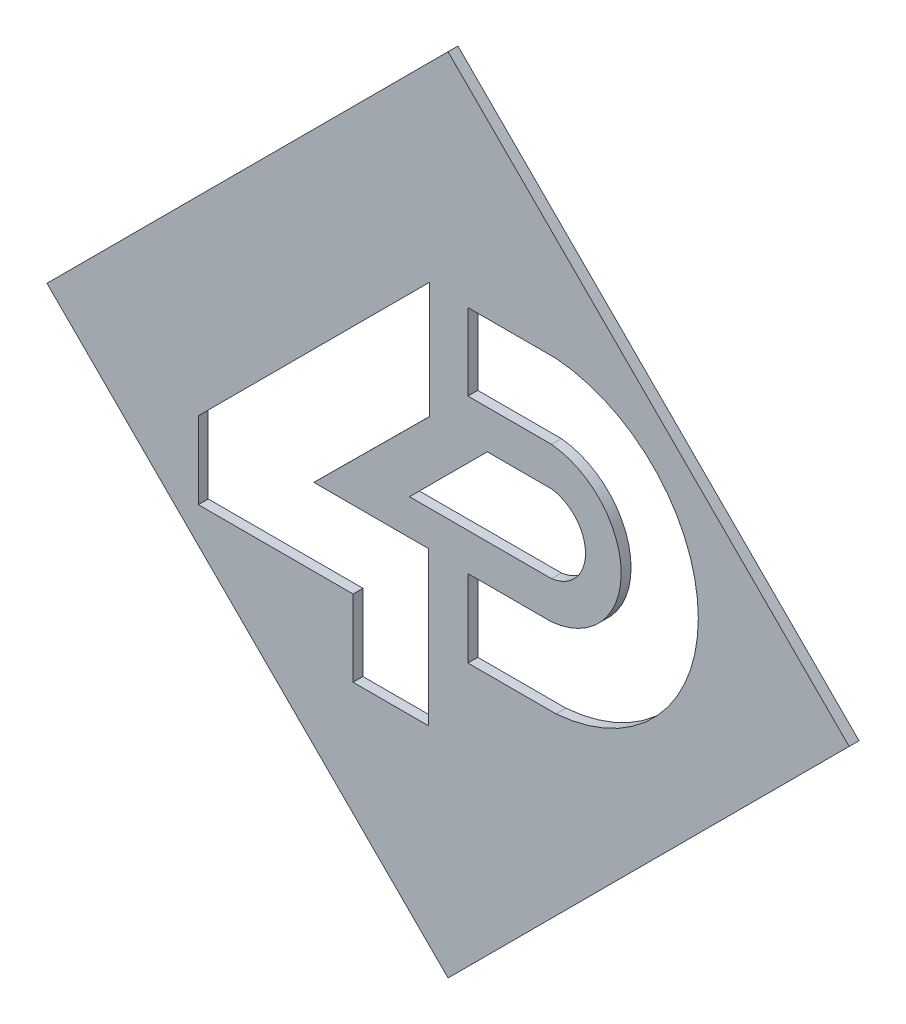
ISO-10303-21;
HEADER;
FILE_DESCRIPTION(('STEP AP214'),'2;1');
FILE_NAME('part.step','',(''),(''),'','','');
FILE_SCHEMA(('AUTOMOTIVE_DESIGN { 1 0 10303 214 1 1 1 1 }'));
ENDSEC;
DATA;
#1=APPLICATION_CONTEXT('core data for automotive mechanical design processes');
#2=APPLICATION_PROTOCOL_DEFINITION('international standard','automotive_design',2000,#1);
#3=PRODUCT_CONTEXT('',#1,'mechanical');
#4=PRODUCT('Part','Part','',(#3));
#5=PRODUCT_RELATED_PRODUCT_CATEGORY('part','',(#4));
#6=PRODUCT_DEFINITION_FORMATION('','',#4);
#7=PRODUCT_DEFINITION_CONTEXT('part definition',#1,'design');
#8=PRODUCT_DEFINITION('design','',#6,#7);
#9=PRODUCT_DEFINITION_SHAPE('','',#8);
#10=(LENGTH_UNIT() NAMED_UNIT(*) SI_UNIT(.MILLI.,.METRE.));
#11=(NAMED_UNIT(*) PLANE_ANGLE_UNIT() SI_UNIT($,.RADIAN.));
#12=(NAMED_UNIT(*) SI_UNIT($,.STERADIAN.) SOLID_ANGLE_UNIT());
#13=UNCERTAINTY_MEASURE_WITH_UNIT(LENGTH_MEASURE(1.E-05),#10,'distance_accuracy_value','');
#14=(GEOMETRIC_REPRESENTATION_CONTEXT(3) GLOBAL_UNCERTAINTY_ASSIGNED_CONTEXT((#13)) GLOBAL_UNIT_ASSIGNED_CONTEXT((#10,
#11,#12)) REPRESENTATION_CONTEXT('',''));
#15=CARTESIAN_POINT('',(0.,0.,0.));
#16=DIRECTION('',(0.,0.,1.));
#17=DIRECTION('',(1.,0.,0.));
#18=AXIS2_PLACEMENT_3D('',#15,#16,#17);
#19=CARTESIAN_POINT('',(0.,0.,0.));
#20=DIRECTION('',(0.,0.,1.));
#21=DIRECTION('',(1.,0.,0.));
#22=AXIS2_PLACEMENT_3D('',#19,#20,#21);
#23=PLANE('',#22);
#24=DIRECTION('',(0.,1.,0.));
#25=VECTOR('',#24,1.);
#26=CARTESIAN_POINT('',(2.34855929874096,0.,0.));
#27=LINE('',#26,#25);
#28=CARTESIAN_POINT('',(2.34855929874096,2.81911332569856,0.));
#29=VERTEX_POINT('',#28);
#30=CARTESIAN_POINT('',(2.34855929874096,3.20697935121629,0.));
#31=VERTEX_POINT('',#30);
#32=EDGE_CURVE('E129',#29,#31,#27,.T.);
#33=ORIENTED_EDGE('',*,*,#32,.F.);
#34=DIRECTION('',(1.,0.,0.));
#35=VECTOR('',#34,1.);
#36=CARTESIAN_POINT('',(0.,2.81911332569856,0.));
#37=LINE('',#36,#35);
#38=CARTESIAN_POINT('',(2.77126569834154,2.81911332569856,0.));
#39=VERTEX_POINT('',#38);
#40=EDGE_CURVE('E120',#39,#29,#37,.F.);
#41=ORIENTED_EDGE('',*,*,#40,.F.);
#42=CARTESIAN_POINT('',(2.73306572387602,2.43000474208377,0.));
#43=DIRECTION('',(0.,0.,-1.));
#44=DIRECTION('',(-1.,0.,0.));
#45=AXIS2_PLACEMENT_3D('',#42,#43,#44);
#46=CIRCLE('',#45,0.390979191123868);
#47=CARTESIAN_POINT('',(2.77126569834155,2.04089615846898,0.));
#48=VERTEX_POINT('',#47);
#49=EDGE_CURVE('E19',#48,#39,#46,.F.);
#50=ORIENTED_EDGE('',*,*,#49,.F.);
#51=DIRECTION('',(1.,0.,0.));
#52=VECTOR('',#51,1.);
#53=CARTESIAN_POINT('',(0.,2.04089615846898,0.));
#54=LINE('',#53,#52);
#55=CARTESIAN_POINT('',(2.34855929874096,2.04089615846898,0.));
#56=VERTEX_POINT('',#55);
#57=EDGE_CURVE('E108',#56,#48,#54,.T.);
#58=ORIENTED_EDGE('',*,*,#57,.F.);
#59=DIRECTION('',(0.,1.,0.));
#60=VECTOR('',#59,1.);
#61=CARTESIAN_POINT('',(2.34855929874096,0.,0.));
#62=LINE('',#61,#60);
#63=CARTESIAN_POINT('',(2.34855929874096,1.64907524947541,0.));
#64=VERTEX_POINT('',#63);
#65=EDGE_CURVE('E140',#64,#56,#62,.T.);
#66=ORIENTED_EDGE('',*,*,#65,.F.);
#67=DIRECTION('',(1.,0.,0.));
#68=VECTOR('',#67,1.);
#69=CARTESIAN_POINT('',(0.,1.64907524947541,0.));
#70=LINE('',#69,#68);
#71=CARTESIAN_POINT('',(2.79424037581923,1.64907524947541,0.));
#72=VERTEX_POINT('',#71);
#73=EDGE_CURVE('E143',#72,#64,#70,.F.);
#74=ORIENTED_EDGE('',*,*,#73,.F.);
#75=CARTESIAN_POINT('',(2.73302059377574,2.42802730034585,0.));
#76=DIRECTION('',(0.,0.,-1.));
#77=DIRECTION('',(-1.,0.,0.));
#78=AXIS2_PLACEMENT_3D('',#75,#76,#77);
#79=CIRCLE('',#78,0.781354055002415);
#80=CARTESIAN_POINT('',(2.79424037581924,3.20697935121629,0.));
#81=VERTEX_POINT('',#80);
#82=EDGE_CURVE('E182',#72,#81,#79,.F.);
#83=ORIENTED_EDGE('',*,*,#82,.T.);
#84=DIRECTION('',(1.,0.,0.));
#85=VECTOR('',#84,1.);
#86=CARTESIAN_POINT('',(0.,3.20697935121629,0.));
#87=LINE('',#86,#85);
#88=EDGE_CURVE('E201',#31,#81,#87,.T.);
#89=ORIENTED_EDGE('',*,*,#88,.F.);
#90=EDGE_LOOP('',(#33,#41,#50,#58,#66,#74,#83,#89));
#91=FACE_BOUND('',#90,.T.);
#92=DIRECTION('',(-0.707106781186548,-0.707106781186548,0.));
#93=VECTOR('',#92,1.);
#94=CARTESIAN_POINT('',(-0.533274055166279,0.533274055166279,0.));
#95=LINE('',#94,#93);
#96=CARTESIAN_POINT('',(2.15427685135592,3.22082496168848,0.));
#97=VERTEX_POINT('',#96);
#98=CARTESIAN_POINT('',(0.984186914350329,2.05073502468289,0.));
#99=VERTEX_POINT('',#98);
#100=EDGE_CURVE('E202',#97,#99,#95,.T.);
#101=ORIENTED_EDGE('',*,*,#100,.T.);
#102=DIRECTION('',(0.,1.,0.));
#103=VECTOR('',#102,1.);
#104=CARTESIAN_POINT('',(0.984186914350328,0.,0.));
#105=LINE('',#104,#103);
#106=CARTESIAN_POINT('',(0.984186914350328,1.66089182529602,0.));
#107=VERTEX_POINT('',#106);
#108=EDGE_CURVE('E223',#99,#107,#105,.F.);
#109=ORIENTED_EDGE('',*,*,#108,.T.);
#110=DIRECTION('',(1.,0.,0.));
#111=VECTOR('',#110,1.);
#112=CARTESIAN_POINT('',(0.,1.66089182529602,0.));
#113=LINE('',#112,#111);
#114=CARTESIAN_POINT('',(1.76699830871032,1.66089182529602,0.));
#115=VERTEX_POINT('',#114);
#116=EDGE_CURVE('E228',#107,#115,#113,.T.);
#117=ORIENTED_EDGE('',*,*,#116,.T.);
#118=DIRECTION('',(0.,1.,0.));
#119=VECTOR('',#118,1.);
#120=CARTESIAN_POINT('',(1.76699830871032,0.,0.));
#121=LINE('',#120,#119);
#122=CARTESIAN_POINT('',(1.76699830871032,1.27417362149543,0.));
#123=VERTEX_POINT('',#122);
#124=EDGE_CURVE('E237',#123,#115,#121,.T.);
#125=ORIENTED_EDGE('',*,*,#124,.F.);
#126=DIRECTION('',(1.,0.,0.));
#127=VECTOR('',#126,1.);
#128=CARTESIAN_POINT('',(0.,1.27417362149543,0.));
#129=LINE('',#128,#127);
#130=CARTESIAN_POINT('',(2.14981026802808,1.27417362149543,0.));
#131=VERTEX_POINT('',#130);
#132=EDGE_CURVE('E243',#131,#123,#129,.F.);
#133=ORIENTED_EDGE('',*,*,#132,.F.);
#134=DIRECTION('',(0.,1.,0.));
#135=VECTOR('',#134,1.);
#136=CARTESIAN_POINT('',(2.14981026802808,0.,0.));
#137=LINE('',#136,#135);
#138=CARTESIAN_POINT('',(2.14981026802808,2.05073502468289,0.));
#139=VERTEX_POINT('',#138);
#140=EDGE_CURVE('E249',#139,#131,#137,.F.);
#141=ORIENTED_EDGE('',*,*,#140,.F.);
#142=DIRECTION('',(1.,0.,0.));
#143=VECTOR('',#142,1.);
#144=CARTESIAN_POINT('',(0.,2.05073502468289,0.));
#145=LINE('',#144,#143);
#146=CARTESIAN_POINT('',(1.56856108898234,2.05073502468289,0.));
#147=VERTEX_POINT('',#146);
#148=EDGE_CURVE('E255',#147,#139,#145,.T.);
#149=ORIENTED_EDGE('',*,*,#148,.F.);
#150=DIRECTION('',(0.709780855705061,0.704422555625948,0.));
#151=VECTOR('',#150,1.);
#152=CARTESIAN_POINT('',(-0.247000591404252,0.248879439941812,0.));
#153=LINE('',#152,#151);
#154=CARTESIAN_POINT('',(2.15427685135592,2.63202908310287,0.));
#155=VERTEX_POINT('',#154);
#156=EDGE_CURVE('E258',#147,#155,#153,.T.);
#157=ORIENTED_EDGE('',*,*,#156,.T.);
#158=DIRECTION('',(0.,1.,0.));
#159=VECTOR('',#158,1.);
#160=CARTESIAN_POINT('',(2.15427685135592,0.,0.));
#161=LINE('',#160,#159);
#162=EDGE_CURVE('E264',#155,#97,#161,.T.);
#163=ORIENTED_EDGE('',*,*,#162,.T.);
#164=EDGE_LOOP('',(#101,#109,#117,#125,#133,#141,#149,#157,#163));
#165=FACE_BOUND('',#164,.T.);
#166=DIRECTION('',(0.707106781186547,0.707106781186548,0.));
#167=VECTOR('',#166,1.);
#168=CARTESIAN_POINT('',(-1.01513037245142,1.01513037245142,0.));
#169=LINE('',#168,#167);
#170=CARTESIAN_POINT('',(0.217904955586662,2.2481657004895,0.));
#171=VERTEX_POINT('',#170);
#172=CARTESIAN_POINT('',(2.24790091175695,4.27816165665979,0.));
#173=VERTEX_POINT('',#172);
#174=EDGE_CURVE('E266',#171,#173,#169,.T.);
#175=ORIENTED_EDGE('',*,*,#174,.T.);
#176=DIRECTION('',(0.707106781186548,-0.707106781186547,0.));
#177=VECTOR('',#176,1.);
#178=CARTESIAN_POINT('',(3.26303128420836,3.26303128420837,0.));
#179=LINE('',#178,#177);
#180=CARTESIAN_POINT('',(4.27789686792724,2.2481657004895,0.));
#181=VERTEX_POINT('',#180);
#182=EDGE_CURVE('E275',#173,#181,#179,.T.);
#183=ORIENTED_EDGE('',*,*,#182,.T.);
#184=DIRECTION('',(-0.707106781186547,-0.707106781186548,0.));
#185=VECTOR('',#184,1.);
#186=CARTESIAN_POINT('',(1.01486558371887,-1.01486558371887,0.));
#187=LINE('',#186,#185);
#188=CARTESIAN_POINT('',(2.24790091175711,0.218169744319375,0.));
#189=VERTEX_POINT('',#188);
#190=EDGE_CURVE('E281',#181,#189,#187,.T.);
#191=ORIENTED_EDGE('',*,*,#190,.T.);
#192=DIRECTION('',(0.707106781186662,-0.707106781186433,0.));
#193=VECTOR('',#192,1.);
#194=CARTESIAN_POINT('',(1.23303532803804,1.23303532803844,0.));
#195=LINE('',#194,#193);
#196=EDGE_CURVE('E156',#171,#189,#195,.T.);
#197=ORIENTED_EDGE('',*,*,#196,.F.);
#198=EDGE_LOOP('',(#175,#183,#191,#197));
#199=FACE_BOUND('',#198,.T.);
#200=DIRECTION('',(-0.707106781186546,-0.707106781186549,0.));
#201=VECTOR('',#200,1.);
#202=CARTESIAN_POINT('',(-0.088632997302492,0.0886329973024917,0.));
#203=LINE('',#202,#201);
#204=CARTESIAN_POINT('',(2.44646139549115,2.62372739009615,0.));
#205=VERTEX_POINT('',#204);
#206=CARTESIAN_POINT('',(2.05288992525324,2.23015591985823,0.));
#207=VERTEX_POINT('',#206);
#208=EDGE_CURVE('E153',#205,#207,#203,.T.);
#209=ORIENTED_EDGE('',*,*,#208,.T.);
#210=DIRECTION('',(1.,0.,0.));
#211=VECTOR('',#210,1.);
#212=CARTESIAN_POINT('',(0.,2.23015591985823,0.));
#213=LINE('',#212,#211);
#214=CARTESIAN_POINT('',(2.77126569834154,2.23015591985823,0.));
#215=VERTEX_POINT('',#214);
#216=EDGE_CURVE('E160',#215,#207,#213,.F.);
#217=ORIENTED_EDGE('',*,*,#216,.F.);
#218=CARTESIAN_POINT('',(2.74507089152506,2.42694165497719,0.));
#219=DIRECTION('',(0.,0.,-1.));
#220=DIRECTION('',(-1.,0.,0.));
#221=AXIS2_PLACEMENT_3D('',#218,#219,#220);
#222=CIRCLE('',#221,0.198521518859953);
#223=CARTESIAN_POINT('',(2.77126569834155,2.62372739009615,0.));
#224=VERTEX_POINT('',#223);
#225=EDGE_CURVE('E163',#215,#224,#222,.F.);
#226=ORIENTED_EDGE('',*,*,#225,.T.);
#227=DIRECTION('',(1.,0.,0.));
#228=VECTOR('',#227,1.);
#229=CARTESIAN_POINT('',(0.,2.62372739009615,0.));
#230=LINE('',#229,#228);
#231=EDGE_CURVE('E131',#224,#205,#230,.F.);
#232=ORIENTED_EDGE('',*,*,#231,.T.);
#233=EDGE_LOOP('',(#209,#217,#226,#232));
#234=FACE_BOUND('',#233,.T.);
#235=ADVANCED_FACE('F16',(#91,#165,#199,#234),#23,.F.);
#236=CARTESIAN_POINT('',(0.,2.62372739009615,0.05));
#237=DIRECTION('',(0.,1.,0.));
#238=DIRECTION('',(0.,0.,1.));
#239=AXIS2_PLACEMENT_3D('',#236,#237,#238);
#240=PLANE('',#239);
#241=DIRECTION('',(0.,0.,-1.));
#242=VECTOR('',#241,1.);
#243=CARTESIAN_POINT('',(2.77126569834155,2.62372739009615,0.05));
#244=LINE('',#243,#242);
#245=CARTESIAN_POINT('',(2.77126569834155,2.62372739009615,0.05));
#246=VERTEX_POINT('',#245);
#247=EDGE_CURVE('E150',#224,#246,#244,.F.);
#248=ORIENTED_EDGE('',*,*,#247,.T.);
#249=DIRECTION('',(1.,0.,0.));
#250=VECTOR('',#249,1.);
#251=CARTESIAN_POINT('',(0.,2.62372739009615,0.05));
#252=LINE('',#251,#250);
#253=CARTESIAN_POINT('',(2.44646139549116,2.62372739009615,0.05));
#254=VERTEX_POINT('',#253);
#255=EDGE_CURVE('E181',#254,#246,#252,.T.);
#256=ORIENTED_EDGE('',*,*,#255,.F.);
#257=DIRECTION('',(0.,0.,1.));
#258=VECTOR('',#257,1.);
#259=CARTESIAN_POINT('',(2.44646139549115,2.62372739009615,0.05));
#260=LINE('',#259,#258);
#261=EDGE_CURVE('E157',#254,#205,#260,.F.);
#262=ORIENTED_EDGE('',*,*,#261,.T.);
#263=ORIENTED_EDGE('',*,*,#231,.F.);
#264=EDGE_LOOP('',(#248,#256,#262,#263));
#265=FACE_BOUND('',#264,.T.);
#266=ADVANCED_FACE('F484',(#265),#240,.F.);
#267=CARTESIAN_POINT('',(2.74507089152506,2.42694165497719,0.05));
#268=DIRECTION('',(0.,0.,-1.));
#269=DIRECTION('',(-1.,0.,0.));
#270=AXIS2_PLACEMENT_3D('',#267,#268,#269);
#271=CYLINDRICAL_SURFACE('',#270,0.198521518859953);
#272=DIRECTION('',(0.,0.,1.));
#273=VECTOR('',#272,1.);
#274=CARTESIAN_POINT('',(2.77126569834155,2.23015591985823,0.05));
#275=LINE('',#274,#273);
#276=CARTESIAN_POINT('',(2.77126569834154,2.23015591985823,0.05));
#277=VERTEX_POINT('',#276);
#278=EDGE_CURVE('E162',#277,#215,#275,.F.);
#279=ORIENTED_EDGE('',*,*,#278,.F.);
#280=CARTESIAN_POINT('',(2.74507089152506,2.42694165497719,0.05));
#281=DIRECTION('',(0.,0.,-1.));
#282=DIRECTION('',(-1.,0.,0.));
#283=AXIS2_PLACEMENT_3D('',#280,#281,#282);
#284=CIRCLE('',#283,0.198521518859953);
#285=EDGE_CURVE('E177',#246,#277,#284,.T.);
#286=ORIENTED_EDGE('',*,*,#285,.F.);
#287=ORIENTED_EDGE('',*,*,#247,.F.);
#288=ORIENTED_EDGE('',*,*,#225,.F.);
#289=EDGE_LOOP('',(#279,#286,#287,#288));
#290=FACE_BOUND('',#289,.T.);
#291=ADVANCED_FACE('F489',(#290),#271,.F.);
#292=CARTESIAN_POINT('',(0.,2.23015591985823,0.05));
#293=DIRECTION('',(0.,1.,0.));
#294=DIRECTION('',(0.,0.,1.));
#295=AXIS2_PLACEMENT_3D('',#292,#293,#294);
#296=PLANE('',#295);
#297=DIRECTION('',(1.,0.,0.));
#298=VECTOR('',#297,1.);
#299=CARTESIAN_POINT('',(0.,2.23015591985823,0.05));
#300=LINE('',#299,#298);
#301=CARTESIAN_POINT('',(2.05288992525324,2.23015591985823,0.05));
#302=VERTEX_POINT('',#301);
#303=EDGE_CURVE('E180',#277,#302,#300,.F.);
#304=ORIENTED_EDGE('',*,*,#303,.F.);
#305=ORIENTED_EDGE('',*,*,#278,.T.);
#306=ORIENTED_EDGE('',*,*,#216,.T.);
#307=DIRECTION('',(0.,0.,1.));
#308=VECTOR('',#307,1.);
#309=CARTESIAN_POINT('',(2.05288992525324,2.23015591985823,0.05));
#310=LINE('',#309,#308);
#311=EDGE_CURVE('E199',#207,#302,#310,.T.);
#312=ORIENTED_EDGE('',*,*,#311,.T.);
#313=EDGE_LOOP('',(#304,#305,#306,#312));
#314=FACE_BOUND('',#313,.T.);
#315=ADVANCED_FACE('F300',(#314),#296,.T.);
#316=CARTESIAN_POINT('',(-0.088632997302492,0.0886329973024917,0.05));
#317=DIRECTION('',(-0.707106781186549,0.707106781186546,0.));
#318=DIRECTION('',(-0.707106781186546,-0.707106781186549,0.));
#319=AXIS2_PLACEMENT_3D('',#316,#317,#318);
#320=PLANE('',#319);
#321=ORIENTED_EDGE('',*,*,#261,.F.);
#322=DIRECTION('',(0.707106781186546,0.707106781186549,0.));
#323=VECTOR('',#322,1.);
#324=CARTESIAN_POINT('',(2.05288992525324,2.23015591985823,0.05));
#325=LINE('',#324,#323);
#326=EDGE_CURVE('E291',#302,#254,#325,.T.);
#327=ORIENTED_EDGE('',*,*,#326,.F.);
#328=ORIENTED_EDGE('',*,*,#311,.F.);
#329=ORIENTED_EDGE('',*,*,#208,.F.);
#330=EDGE_LOOP('',(#321,#327,#328,#329));
#331=FACE_BOUND('',#330,.T.);
#332=ADVANCED_FACE('F305',(#331),#320,.F.);
#333=CARTESIAN_POINT('',(1.23303532803804,1.23303532803844,0.05));
#334=DIRECTION('',(-0.707106781186433,-0.707106781186662,0.));
#335=DIRECTION('',(0.707106781186662,-0.707106781186433,0.));
#336=AXIS2_PLACEMENT_3D('',#333,#334,#335);
#337=PLANE('',#336);
#338=DIRECTION('',(0.707106781186548,-0.707106781186547,0.));
#339=VECTOR('',#338,1.);
#340=CARTESIAN_POINT('',(0.217904955586661,2.2481657004895,0.05));
#341=LINE('',#340,#339);
#342=CARTESIAN_POINT('',(0.217904955586661,2.2481657004895,0.05));
#343=VERTEX_POINT('',#342);
#344=CARTESIAN_POINT('',(2.24790091175711,0.218169744319375,0.05));
#345=VERTEX_POINT('',#344);
#346=EDGE_CURVE('E294',#343,#345,#341,.T.);
#347=ORIENTED_EDGE('',*,*,#346,.F.);
#348=DIRECTION('',(0.,0.,1.));
#349=VECTOR('',#348,1.);
#350=CARTESIAN_POINT('',(0.217904955586662,2.2481657004895,0.05));
#351=LINE('',#350,#349);
#352=EDGE_CURVE('E269',#343,#171,#351,.F.);
#353=ORIENTED_EDGE('',*,*,#352,.T.);
#354=ORIENTED_EDGE('',*,*,#196,.T.);
#355=DIRECTION('',(0.,0.,1.));
#356=VECTOR('',#355,1.);
#357=CARTESIAN_POINT('',(2.24790091175695,0.218169744319212,0.05));
#358=LINE('',#357,#356);
#359=EDGE_CURVE('E284',#189,#345,#358,.T.);
#360=ORIENTED_EDGE('',*,*,#359,.T.);
#361=EDGE_LOOP('',(#347,#353,#354,#360));
#362=FACE_BOUND('',#361,.T.);
#363=ADVANCED_FACE('F404',(#362),#337,.T.);
#364=CARTESIAN_POINT('',(1.01486558371887,-1.01486558371887,0.05));
#365=DIRECTION('',(-0.707106781186548,0.707106781186547,0.));
#366=DIRECTION('',(-0.707106781186547,-0.707106781186548,0.));
#367=AXIS2_PLACEMENT_3D('',#364,#365,#366);
#368=PLANE('',#367);
#369=DIRECTION('',(0.,0.,1.));
#370=VECTOR('',#369,1.);
#371=CARTESIAN_POINT('',(4.27789686792724,2.2481657004895,0.05));
#372=LINE('',#371,#370);
#373=CARTESIAN_POINT('',(4.27789686792724,2.2481657004895,0.05));
#374=VERTEX_POINT('',#373);
#375=EDGE_CURVE('E278',#181,#374,#372,.T.);
#376=ORIENTED_EDGE('',*,*,#375,.T.);
#377=DIRECTION('',(0.707106781186547,0.707106781186548,0.));
#378=VECTOR('',#377,1.);
#379=CARTESIAN_POINT('',(2.24790091175695,0.218169744319211,0.05));
#380=LINE('',#379,#378);
#381=EDGE_CURVE('E392',#345,#374,#380,.T.);
#382=ORIENTED_EDGE('',*,*,#381,.F.);
#383=ORIENTED_EDGE('',*,*,#359,.F.);
#384=ORIENTED_EDGE('',*,*,#190,.F.);
#385=EDGE_LOOP('',(#376,#382,#383,#384));
#386=FACE_BOUND('',#385,.T.);
#387=ADVANCED_FACE('F555',(#386),#368,.F.);
#388=CARTESIAN_POINT('',(3.26303128420836,3.26303128420837,0.05));
#389=DIRECTION('',(-0.707106781186547,-0.707106781186548,0.));
#390=DIRECTION('',(0.707106781186548,-0.707106781186547,0.));
#391=AXIS2_PLACEMENT_3D('',#388,#389,#390);
#392=PLANE('',#391);
#393=DIRECTION('',(0.,0.,1.));
#394=VECTOR('',#393,1.);
#395=CARTESIAN_POINT('',(2.24790091175695,4.27816165665979,0.05));
#396=LINE('',#395,#394);
#397=CARTESIAN_POINT('',(2.24790091175695,4.27816165665979,0.05));
#398=VERTEX_POINT('',#397);
#399=EDGE_CURVE('E272',#173,#398,#396,.T.);
#400=ORIENTED_EDGE('',*,*,#399,.T.);
#401=DIRECTION('',(-0.707106781186548,0.707106781186547,0.));
#402=VECTOR('',#401,1.);
#403=CARTESIAN_POINT('',(4.27789686792724,2.2481657004895,0.05));
#404=LINE('',#403,#402);
#405=EDGE_CURVE('E390',#374,#398,#404,.T.);
#406=ORIENTED_EDGE('',*,*,#405,.F.);
#407=ORIENTED_EDGE('',*,*,#375,.F.);
#408=ORIENTED_EDGE('',*,*,#182,.F.);
#409=EDGE_LOOP('',(#400,#406,#407,#408));
#410=FACE_BOUND('',#409,.T.);
#411=ADVANCED_FACE('F552',(#410),#392,.F.);
#412=CARTESIAN_POINT('',(-1.01513037245142,1.01513037245142,0.05));
#413=DIRECTION('',(0.707106781186548,-0.707106781186547,0.));
#414=DIRECTION('',(0.707106781186547,0.707106781186548,0.));
#415=AXIS2_PLACEMENT_3D('',#412,#413,#414);
#416=PLANE('',#415);
#417=ORIENTED_EDGE('',*,*,#352,.F.);
#418=DIRECTION('',(-0.707106781186547,-0.707106781186548,0.));
#419=VECTOR('',#418,1.);
#420=CARTESIAN_POINT('',(2.24790091175695,4.27816165665979,0.05));
#421=LINE('',#420,#419);
#422=EDGE_CURVE('E387',#398,#343,#421,.T.);
#423=ORIENTED_EDGE('',*,*,#422,.F.);
#424=ORIENTED_EDGE('',*,*,#399,.F.);
#425=ORIENTED_EDGE('',*,*,#174,.F.);
#426=EDGE_LOOP('',(#417,#423,#424,#425));
#427=FACE_BOUND('',#426,.T.);
#428=ADVANCED_FACE('F410',(#427),#416,.F.);
#429=CARTESIAN_POINT('',(2.15427685135592,0.,0.05));
#430=DIRECTION('',(1.,0.,0.));
#431=DIRECTION('',(0.,0.,-1.));
#432=AXIS2_PLACEMENT_3D('',#429,#430,#431);
#433=PLANE('',#432);
#434=DIRECTION('',(0.,0.,1.));
#435=VECTOR('',#434,1.);
#436=CARTESIAN_POINT('',(2.15427685135592,2.63202908310287,0.05));
#437=LINE('',#436,#435);
#438=CARTESIAN_POINT('',(2.15427685135592,2.63202908310287,0.05));
#439=VERTEX_POINT('',#438);
#440=EDGE_CURVE('E261',#155,#439,#437,.T.);
#441=ORIENTED_EDGE('',*,*,#440,.T.);
#442=DIRECTION('',(0.,1.,0.));
#443=VECTOR('',#442,1.);
#444=CARTESIAN_POINT('',(2.15427685135592,0.,0.05));
#445=LINE('',#444,#443);
#446=CARTESIAN_POINT('',(2.15427685135592,3.22082496168848,0.05));
#447=VERTEX_POINT('',#446);
#448=EDGE_CURVE('E384',#447,#439,#445,.F.);
#449=ORIENTED_EDGE('',*,*,#448,.F.);
#450=DIRECTION('',(0.,0.,1.));
#451=VECTOR('',#450,1.);
#452=CARTESIAN_POINT('',(2.15427685135592,3.22082496168848,0.05));
#453=LINE('',#452,#451);
#454=EDGE_CURVE('E207',#447,#97,#453,.F.);
#455=ORIENTED_EDGE('',*,*,#454,.T.);
#456=ORIENTED_EDGE('',*,*,#162,.F.);
#457=EDGE_LOOP('',(#441,#449,#455,#456));
#458=FACE_BOUND('',#457,.T.);
#459=ADVANCED_FACE('F545',(#458),#433,.F.);
#460=CARTESIAN_POINT('',(-0.247000591404252,0.248879439941812,0.05));
#461=DIRECTION('',(0.704422555625948,-0.709780855705061,0.));
#462=DIRECTION('',(0.709780855705061,0.704422555625948,0.));
#463=AXIS2_PLACEMENT_3D('',#460,#461,#462);
#464=PLANE('',#463);
#465=DIRECTION('',(0.,0.,-1.));
#466=VECTOR('',#465,1.);
#467=CARTESIAN_POINT('',(1.56856108898234,2.05073502468289,0.05));
#468=LINE('',#467,#466);
#469=CARTESIAN_POINT('',(1.56856108898234,2.05073502468289,0.05));
#470=VERTEX_POINT('',#469);
#471=EDGE_CURVE('E252',#470,#147,#468,.T.);
#472=ORIENTED_EDGE('',*,*,#471,.F.);
#473=DIRECTION('',(-0.70978085570506,-0.704422555625948,0.));
#474=VECTOR('',#473,1.);
#475=CARTESIAN_POINT('',(2.15427685135592,2.63202908310287,0.05));
#476=LINE('',#475,#474);
#477=EDGE_CURVE('E381',#439,#470,#476,.T.);
#478=ORIENTED_EDGE('',*,*,#477,.F.);
#479=ORIENTED_EDGE('',*,*,#440,.F.);
#480=ORIENTED_EDGE('',*,*,#156,.F.);
#481=EDGE_LOOP('',(#472,#478,#479,#480));
#482=FACE_BOUND('',#481,.T.);
#483=ADVANCED_FACE('F541',(#482),#464,.F.);
#484=CARTESIAN_POINT('',(0.,2.05073502468289,0.05));
#485=DIRECTION('',(0.,-1.,0.));
#486=DIRECTION('',(0.,0.,-1.));
#487=AXIS2_PLACEMENT_3D('',#484,#485,#486);
#488=PLANE('',#487);
#489=DIRECTION('',(1.,0.,0.));
#490=VECTOR('',#489,1.);
#491=CARTESIAN_POINT('',(0.,2.05073502468289,0.05));
#492=LINE('',#491,#490);
#493=CARTESIAN_POINT('',(2.14981026802808,2.05073502468289,0.05));
#494=VERTEX_POINT('',#493);
#495=EDGE_CURVE('E378',#470,#494,#492,.T.);
#496=ORIENTED_EDGE('',*,*,#495,.F.);
#497=ORIENTED_EDGE('',*,*,#471,.T.);
#498=ORIENTED_EDGE('',*,*,#148,.T.);
#499=DIRECTION('',(0.,0.,1.));
#500=VECTOR('',#499,1.);
#501=CARTESIAN_POINT('',(2.14981026802808,2.05073502468289,0.05));
#502=LINE('',#501,#500);
#503=EDGE_CURVE('E246',#494,#139,#502,.F.);
#504=ORIENTED_EDGE('',*,*,#503,.F.);
#505=EDGE_LOOP('',(#496,#497,#498,#504));
#506=FACE_BOUND('',#505,.T.);
#507=ADVANCED_FACE('F537',(#506),#488,.T.);
#508=CARTESIAN_POINT('',(2.14981026802808,0.,0.05));
#509=DIRECTION('',(-1.,0.,0.));
#510=DIRECTION('',(0.,0.,1.));
#511=AXIS2_PLACEMENT_3D('',#508,#509,#510);
#512=PLANE('',#511);
#513=DIRECTION('',(0.,1.,0.));
#514=VECTOR('',#513,1.);
#515=CARTESIAN_POINT('',(2.14981026802808,0.,0.05));
#516=LINE('',#515,#514);
#517=CARTESIAN_POINT('',(2.14981026802808,1.27417362149543,0.05));
#518=VERTEX_POINT('',#517);
#519=EDGE_CURVE('E375',#494,#518,#516,.F.);
#520=ORIENTED_EDGE('',*,*,#519,.F.);
#521=ORIENTED_EDGE('',*,*,#503,.T.);
#522=ORIENTED_EDGE('',*,*,#140,.T.);
#523=DIRECTION('',(0.,0.,1.));
#524=VECTOR('',#523,1.);
#525=CARTESIAN_POINT('',(2.14981026802808,1.27417362149543,0.05));
#526=LINE('',#525,#524);
#527=EDGE_CURVE('E240',#518,#131,#526,.F.);
#528=ORIENTED_EDGE('',*,*,#527,.F.);
#529=EDGE_LOOP('',(#520,#521,#522,#528));
#530=FACE_BOUND('',#529,.T.);
#531=ADVANCED_FACE('F533',(#530),#512,.T.);
#532=CARTESIAN_POINT('',(0.,1.27417362149543,0.05));
#533=DIRECTION('',(0.,1.,0.));
#534=DIRECTION('',(0.,0.,1.));
#535=AXIS2_PLACEMENT_3D('',#532,#533,#534);
#536=PLANE('',#535);
#537=DIRECTION('',(1.,0.,0.));
#538=VECTOR('',#537,1.);
#539=CARTESIAN_POINT('',(0.,1.27417362149543,0.05));
#540=LINE('',#539,#538);
#541=CARTESIAN_POINT('',(1.76699830871032,1.27417362149543,0.05));
#542=VERTEX_POINT('',#541);
#543=EDGE_CURVE('E372',#518,#542,#540,.F.);
#544=ORIENTED_EDGE('',*,*,#543,.F.);
#545=ORIENTED_EDGE('',*,*,#527,.T.);
#546=ORIENTED_EDGE('',*,*,#132,.T.);
#547=DIRECTION('',(0.,0.,-1.));
#548=VECTOR('',#547,1.);
#549=CARTESIAN_POINT('',(1.76699830871032,1.27417362149543,0.05));
#550=LINE('',#549,#548);
#551=EDGE_CURVE('E234',#542,#123,#550,.T.);
#552=ORIENTED_EDGE('',*,*,#551,.F.);
#553=EDGE_LOOP('',(#544,#545,#546,#552));
#554=FACE_BOUND('',#553,.T.);
#555=ADVANCED_FACE('F529',(#554),#536,.T.);
#556=CARTESIAN_POINT('',(1.76699830871032,0.,0.05));
#557=DIRECTION('',(1.,0.,0.));
#558=DIRECTION('',(0.,0.,-1.));
#559=AXIS2_PLACEMENT_3D('',#556,#557,#558);
#560=PLANE('',#559);
#561=DIRECTION('',(0.,1.,0.));
#562=VECTOR('',#561,1.);
#563=CARTESIAN_POINT('',(1.76699830871032,0.,0.05));
#564=LINE('',#563,#562);
#565=CARTESIAN_POINT('',(1.76699830871032,1.66089182529602,0.05));
#566=VERTEX_POINT('',#565);
#567=EDGE_CURVE('E369',#542,#566,#564,.T.);
#568=ORIENTED_EDGE('',*,*,#567,.F.);
#569=ORIENTED_EDGE('',*,*,#551,.T.);
#570=ORIENTED_EDGE('',*,*,#124,.T.);
#571=DIRECTION('',(0.,0.,-1.));
#572=VECTOR('',#571,1.);
#573=CARTESIAN_POINT('',(1.76699830871032,1.66089182529602,0.05));
#574=LINE('',#573,#572);
#575=EDGE_CURVE('E231',#115,#566,#574,.F.);
#576=ORIENTED_EDGE('',*,*,#575,.T.);
#577=EDGE_LOOP('',(#568,#569,#570,#576));
#578=FACE_BOUND('',#577,.T.);
#579=ADVANCED_FACE('F526',(#578),#560,.T.);
#580=CARTESIAN_POINT('',(0.,1.66089182529602,0.05));
#581=DIRECTION('',(0.,-1.,0.));
#582=DIRECTION('',(0.,0.,-1.));
#583=AXIS2_PLACEMENT_3D('',#580,#581,#582);
#584=PLANE('',#583);
#585=DIRECTION('',(0.,0.,1.));
#586=VECTOR('',#585,1.);
#587=CARTESIAN_POINT('',(0.984186914350328,1.66089182529602,0.05));
#588=LINE('',#587,#586);
#589=CARTESIAN_POINT('',(0.984186914350328,1.66089182529602,0.05));
#590=VERTEX_POINT('',#589);
#591=EDGE_CURVE('E225',#107,#590,#588,.T.);
#592=ORIENTED_EDGE('',*,*,#591,.T.);
#593=DIRECTION('',(1.,0.,0.));
#594=VECTOR('',#593,1.);
#595=CARTESIAN_POINT('',(0.,1.66089182529602,0.05));
#596=LINE('',#595,#594);
#597=EDGE_CURVE('E366',#566,#590,#596,.F.);
#598=ORIENTED_EDGE('',*,*,#597,.F.);
#599=ORIENTED_EDGE('',*,*,#575,.F.);
#600=ORIENTED_EDGE('',*,*,#116,.F.);
#601=EDGE_LOOP('',(#592,#598,#599,#600));
#602=FACE_BOUND('',#601,.T.);
#603=ADVANCED_FACE('F482',(#602),#584,.F.);
#604=CARTESIAN_POINT('',(0.984186914350328,0.,0.05));
#605=DIRECTION('',(-1.,0.,0.));
#606=DIRECTION('',(0.,0.,1.));
#607=AXIS2_PLACEMENT_3D('',#604,#605,#606);
#608=PLANE('',#607);
#609=DIRECTION('',(0.,0.,1.));
#610=VECTOR('',#609,1.);
#611=CARTESIAN_POINT('',(0.984186914350329,2.05073502468289,0.05));
#612=LINE('',#611,#610);
#613=CARTESIAN_POINT('',(0.984186914350329,2.05073502468289,0.05));
#614=VERTEX_POINT('',#613);
#615=EDGE_CURVE('E215',#99,#614,#612,.T.);
#616=ORIENTED_EDGE('',*,*,#615,.T.);
#617=DIRECTION('',(0.,1.,0.));
#618=VECTOR('',#617,1.);
#619=CARTESIAN_POINT('',(0.984186914350328,0.,0.05));
#620=LINE('',#619,#618);
#621=EDGE_CURVE('E363',#590,#614,#620,.T.);
#622=ORIENTED_EDGE('',*,*,#621,.F.);
#623=ORIENTED_EDGE('',*,*,#591,.F.);
#624=ORIENTED_EDGE('',*,*,#108,.F.);
#625=EDGE_LOOP('',(#616,#622,#623,#624));
#626=FACE_BOUND('',#625,.T.);
#627=ADVANCED_FACE('F473',(#626),#608,.F.);
#628=CARTESIAN_POINT('',(-0.533274055166279,0.533274055166279,0.05));
#629=DIRECTION('',(-0.707106781186548,0.707106781186548,0.));
#630=DIRECTION('',(-0.707106781186548,-0.707106781186548,0.));
#631=AXIS2_PLACEMENT_3D('',#628,#629,#630);
#632=PLANE('',#631);
#633=ORIENTED_EDGE('',*,*,#454,.F.);
#634=DIRECTION('',(0.707106781186548,0.707106781186547,0.));
#635=VECTOR('',#634,1.);
#636=CARTESIAN_POINT('',(0.984186914350328,2.05073502468289,0.05));
#637=LINE('',#636,#635);
#638=EDGE_CURVE('E358',#614,#447,#637,.T.);
#639=ORIENTED_EDGE('',*,*,#638,.F.);
#640=ORIENTED_EDGE('',*,*,#615,.F.);
#641=ORIENTED_EDGE('',*,*,#100,.F.);
#642=EDGE_LOOP('',(#633,#639,#640,#641));
#643=FACE_BOUND('',#642,.T.);
#644=ADVANCED_FACE('F477',(#643),#632,.F.);
#645=CARTESIAN_POINT('',(0.,3.20697935121629,0.05));
#646=DIRECTION('',(0.,-1.,0.));
#647=DIRECTION('',(0.,0.,-1.));
#648=AXIS2_PLACEMENT_3D('',#645,#646,#647);
#649=PLANE('',#648);
#650=DIRECTION('',(1.,0.,0.));
#651=VECTOR('',#650,1.);
#652=CARTESIAN_POINT('',(0.,3.20697935121629,0.05));
#653=LINE('',#652,#651);
#654=CARTESIAN_POINT('',(2.34855929874096,3.20697935121629,0.05));
#655=VERTEX_POINT('',#654);
#656=CARTESIAN_POINT('',(2.79424037581924,3.20697935121629,0.05));
#657=VERTEX_POINT('',#656);
#658=EDGE_CURVE('E176',#655,#657,#653,.T.);
#659=ORIENTED_EDGE('',*,*,#658,.F.);
#660=DIRECTION('',(0.,0.,-1.));
#661=VECTOR('',#660,1.);
#662=CARTESIAN_POINT('',(2.34855929874096,3.20697935121629,0.05));
#663=LINE('',#662,#661);
#664=EDGE_CURVE('E124',#31,#655,#663,.F.);
#665=ORIENTED_EDGE('',*,*,#664,.F.);
#666=ORIENTED_EDGE('',*,*,#88,.T.);
#667=DIRECTION('',(0.,0.,-1.));
#668=VECTOR('',#667,1.);
#669=CARTESIAN_POINT('',(2.79424037581923,3.20697935121629,0.05));
#670=LINE('',#669,#668);
#671=EDGE_CURVE('E185',#81,#657,#670,.F.);
#672=ORIENTED_EDGE('',*,*,#671,.T.);
#673=EDGE_LOOP('',(#659,#665,#666,#672));
#674=FACE_BOUND('',#673,.T.);
#675=ADVANCED_FACE('F516',(#674),#649,.T.);
#676=CARTESIAN_POINT('',(2.73302059377574,2.42802730034585,0.05));
#677=DIRECTION('',(0.,0.,-1.));
#678=DIRECTION('',(-1.,0.,0.));
#679=AXIS2_PLACEMENT_3D('',#676,#677,#678);
#680=CYLINDRICAL_SURFACE('',#679,0.781354055002415);
#681=DIRECTION('',(0.,0.,1.));
#682=VECTOR('',#681,1.);
#683=CARTESIAN_POINT('',(2.79424037581923,1.64907524947541,0.05));
#684=LINE('',#683,#682);
#685=CARTESIAN_POINT('',(2.79424037581923,1.64907524947541,0.05));
#686=VERTEX_POINT('',#685);
#687=EDGE_CURVE('E184',#686,#72,#684,.F.);
#688=ORIENTED_EDGE('',*,*,#687,.F.);
#689=CARTESIAN_POINT('',(2.73302059377574,2.42802730034585,0.05));
#690=DIRECTION('',(0.,0.,-1.));
#691=DIRECTION('',(-1.,0.,0.));
#692=AXIS2_PLACEMENT_3D('',#689,#690,#691);
#693=CIRCLE('',#692,0.781354055002415);
#694=EDGE_CURVE('E172',#657,#686,#693,.T.);
#695=ORIENTED_EDGE('',*,*,#694,.F.);
#696=ORIENTED_EDGE('',*,*,#671,.F.);
#697=ORIENTED_EDGE('',*,*,#82,.F.);
#698=EDGE_LOOP('',(#688,#695,#696,#697));
#699=FACE_BOUND('',#698,.T.);
#700=ADVANCED_FACE('F512',(#699),#680,.F.);
#701=CARTESIAN_POINT('',(0.,1.64907524947541,0.05));
#702=DIRECTION('',(0.,1.,0.));
#703=DIRECTION('',(0.,0.,1.));
#704=AXIS2_PLACEMENT_3D('',#701,#702,#703);
#705=PLANE('',#704);
#706=DIRECTION('',(1.,0.,0.));
#707=VECTOR('',#706,1.);
#708=CARTESIAN_POINT('',(0.,1.64907524947541,0.05));
#709=LINE('',#708,#707);
#710=CARTESIAN_POINT('',(2.34855929874096,1.64907524947541,0.05));
#711=VERTEX_POINT('',#710);
#712=EDGE_CURVE('E175',#686,#711,#709,.F.);
#713=ORIENTED_EDGE('',*,*,#712,.F.);
#714=ORIENTED_EDGE('',*,*,#687,.T.);
#715=ORIENTED_EDGE('',*,*,#73,.T.);
#716=DIRECTION('',(0.,0.,-1.));
#717=VECTOR('',#716,1.);
#718=CARTESIAN_POINT('',(2.34855929874096,1.64907524947541,0.05));
#719=LINE('',#718,#717);
#720=EDGE_CURVE('E326',#711,#64,#719,.T.);
#721=ORIENTED_EDGE('',*,*,#720,.F.);
#722=EDGE_LOOP('',(#713,#714,#715,#721));
#723=FACE_BOUND('',#722,.T.);
#724=ADVANCED_FACE('F508',(#723),#705,.T.);
#725=CARTESIAN_POINT('',(2.34855929874096,0.,0.05));
#726=DIRECTION('',(1.,0.,0.));
#727=DIRECTION('',(0.,0.,-1.));
#728=AXIS2_PLACEMENT_3D('',#725,#726,#727);
#729=PLANE('',#728);
#730=DIRECTION('',(0.,1.,0.));
#731=VECTOR('',#730,1.);
#732=CARTESIAN_POINT('',(2.34855929874096,0.,0.05));
#733=LINE('',#732,#731);
#734=CARTESIAN_POINT('',(2.34855929874096,2.04089615846898,0.05));
#735=VERTEX_POINT('',#734);
#736=EDGE_CURVE('E329',#711,#735,#733,.T.);
#737=ORIENTED_EDGE('',*,*,#736,.F.);
#738=ORIENTED_EDGE('',*,*,#720,.T.);
#739=ORIENTED_EDGE('',*,*,#65,.T.);
#740=DIRECTION('',(0.,0.,-1.));
#741=VECTOR('',#740,1.);
#742=CARTESIAN_POINT('',(2.34855929874096,2.04089615846898,0.05));
#743=LINE('',#742,#741);
#744=EDGE_CURVE('E324',#735,#56,#743,.T.);
#745=ORIENTED_EDGE('',*,*,#744,.F.);
#746=EDGE_LOOP('',(#737,#738,#739,#745));
#747=FACE_BOUND('',#746,.T.);
#748=ADVANCED_FACE('F505',(#747),#729,.T.);
#749=CARTESIAN_POINT('',(0.,2.04089615846898,0.05));
#750=DIRECTION('',(0.,-1.,0.));
#751=DIRECTION('',(0.,0.,-1.));
#752=AXIS2_PLACEMENT_3D('',#749,#750,#751);
#753=PLANE('',#752);
#754=DIRECTION('',(1.,0.,0.));
#755=VECTOR('',#754,1.);
#756=CARTESIAN_POINT('',(0.,2.04089615846898,0.05));
#757=LINE('',#756,#755);
#758=CARTESIAN_POINT('',(2.77126569834155,2.04089615846898,0.05));
#759=VERTEX_POINT('',#758);
#760=EDGE_CURVE('E171',#735,#759,#757,.T.);
#761=ORIENTED_EDGE('',*,*,#760,.F.);
#762=ORIENTED_EDGE('',*,*,#744,.T.);
#763=ORIENTED_EDGE('',*,*,#57,.T.);
#764=DIRECTION('',(0.,0.,-1.));
#765=VECTOR('',#764,1.);
#766=CARTESIAN_POINT('',(2.77126569834155,2.04089615846898,0.05));
#767=LINE('',#766,#765);
#768=EDGE_CURVE('E117',#759,#48,#767,.T.);
#769=ORIENTED_EDGE('',*,*,#768,.F.);
#770=EDGE_LOOP('',(#761,#762,#763,#769));
#771=FACE_BOUND('',#770,.T.);
#772=ADVANCED_FACE('F502',(#771),#753,.T.);
#773=CARTESIAN_POINT('',(2.73306572387602,2.43000474208377,0.05));
#774=DIRECTION('',(0.,0.,-1.));
#775=DIRECTION('',(-1.,0.,0.));
#776=AXIS2_PLACEMENT_3D('',#773,#774,#775);
#777=CYLINDRICAL_SURFACE('',#776,0.390979191123868);
#778=CARTESIAN_POINT('',(2.73306572387602,2.43000474208377,0.05));
#779=DIRECTION('',(0.,0.,-1.));
#780=DIRECTION('',(-1.,0.,0.));
#781=AXIS2_PLACEMENT_3D('',#778,#779,#780);
#782=CIRCLE('',#781,0.390979191123868);
#783=CARTESIAN_POINT('',(2.77126569834154,2.81911332569856,0.05));
#784=VERTEX_POINT('',#783);
#785=EDGE_CURVE('E169',#759,#784,#782,.F.);
#786=ORIENTED_EDGE('',*,*,#785,.F.);
#787=ORIENTED_EDGE('',*,*,#768,.T.);
#788=ORIENTED_EDGE('',*,*,#49,.T.);
#789=DIRECTION('',(0.,0.,1.));
#790=VECTOR('',#789,1.);
#791=CARTESIAN_POINT('',(2.77126569834155,2.81911332569856,0.05));
#792=LINE('',#791,#790);
#793=EDGE_CURVE('E116',#784,#39,#792,.F.);
#794=ORIENTED_EDGE('',*,*,#793,.F.);
#795=EDGE_LOOP('',(#786,#787,#788,#794));
#796=FACE_BOUND('',#795,.T.);
#797=ADVANCED_FACE('F115',(#796),#777,.T.);
#798=CARTESIAN_POINT('',(0.,2.81911332569856,0.05));
#799=DIRECTION('',(0.,1.,0.));
#800=DIRECTION('',(0.,0.,1.));
#801=AXIS2_PLACEMENT_3D('',#798,#799,#800);
#802=PLANE('',#801);
#803=DIRECTION('',(1.,0.,0.));
#804=VECTOR('',#803,1.);
#805=CARTESIAN_POINT('',(0.,2.81911332569856,0.05));
#806=LINE('',#805,#804);
#807=CARTESIAN_POINT('',(2.34855929874096,2.81911332569856,0.05));
#808=VERTEX_POINT('',#807);
#809=EDGE_CURVE('E25',#784,#808,#806,.F.);
#810=ORIENTED_EDGE('',*,*,#809,.F.);
#811=ORIENTED_EDGE('',*,*,#793,.T.);
#812=ORIENTED_EDGE('',*,*,#40,.T.);
#813=DIRECTION('',(0.,0.,-1.));
#814=VECTOR('',#813,1.);
#815=CARTESIAN_POINT('',(2.34855929874096,2.81911332569856,0.05));
#816=LINE('',#815,#814);
#817=EDGE_CURVE('E34',#808,#29,#816,.T.);
#818=ORIENTED_EDGE('',*,*,#817,.F.);
#819=EDGE_LOOP('',(#810,#811,#812,#818));
#820=FACE_BOUND('',#819,.T.);
#821=ADVANCED_FACE('F121',(#820),#802,.T.);
#822=CARTESIAN_POINT('',(2.34855929874096,0.,0.05));
#823=DIRECTION('',(1.,0.,0.));
#824=DIRECTION('',(0.,0.,-1.));
#825=AXIS2_PLACEMENT_3D('',#822,#823,#824);
#826=PLANE('',#825);
#827=DIRECTION('',(0.,1.,0.));
#828=VECTOR('',#827,1.);
#829=CARTESIAN_POINT('',(2.34855929874096,0.,0.05));
#830=LINE('',#829,#828);
#831=EDGE_CURVE('E11',#808,#655,#830,.T.);
#832=ORIENTED_EDGE('',*,*,#831,.F.);
#833=ORIENTED_EDGE('',*,*,#817,.T.);
#834=ORIENTED_EDGE('',*,*,#32,.T.);
#835=ORIENTED_EDGE('',*,*,#664,.T.);
#836=EDGE_LOOP('',(#832,#833,#834,#835));
#837=FACE_BOUND('',#836,.T.);
#838=ADVANCED_FACE('F341',(#837),#826,.T.);
#839=CARTESIAN_POINT('',(0.,0.,0.05));
#840=DIRECTION('',(0.,0.,1.));
#841=DIRECTION('',(1.,0.,0.));
#842=AXIS2_PLACEMENT_3D('',#839,#840,#841);
#843=PLANE('',#842);
#844=ORIENTED_EDGE('',*,*,#809,.T.);
#845=ORIENTED_EDGE('',*,*,#831,.T.);
#846=ORIENTED_EDGE('',*,*,#658,.T.);
#847=ORIENTED_EDGE('',*,*,#694,.T.);
#848=ORIENTED_EDGE('',*,*,#712,.T.);
#849=ORIENTED_EDGE('',*,*,#736,.T.);
#850=ORIENTED_EDGE('',*,*,#760,.T.);
#851=ORIENTED_EDGE('',*,*,#785,.T.);
#852=EDGE_LOOP('',(#844,#845,#846,#847,#848,#849,#850,#851));
#853=FACE_BOUND('',#852,.T.);
#854=ORIENTED_EDGE('',*,*,#621,.T.);
#855=ORIENTED_EDGE('',*,*,#638,.T.);
#856=ORIENTED_EDGE('',*,*,#448,.T.);
#857=ORIENTED_EDGE('',*,*,#477,.T.);
#858=ORIENTED_EDGE('',*,*,#495,.T.);
#859=ORIENTED_EDGE('',*,*,#519,.T.);
#860=ORIENTED_EDGE('',*,*,#543,.T.);
#861=ORIENTED_EDGE('',*,*,#567,.T.);
#862=ORIENTED_EDGE('',*,*,#597,.T.);
#863=EDGE_LOOP('',(#854,#855,#856,#857,#858,#859,#860,#861,#862));
#864=FACE_BOUND('',#863,.T.);
#865=ORIENTED_EDGE('',*,*,#405,.T.);
#866=ORIENTED_EDGE('',*,*,#422,.T.);
#867=ORIENTED_EDGE('',*,*,#346,.T.);
#868=ORIENTED_EDGE('',*,*,#381,.T.);
#869=EDGE_LOOP('',(#865,#866,#867,#868));
#870=FACE_BOUND('',#869,.T.);
#871=ORIENTED_EDGE('',*,*,#303,.T.);
#872=ORIENTED_EDGE('',*,*,#326,.T.);
#873=ORIENTED_EDGE('',*,*,#255,.T.);
#874=ORIENTED_EDGE('',*,*,#285,.T.);
#875=EDGE_LOOP('',(#871,#872,#873,#874));
#876=FACE_BOUND('',#875,.T.);
#877=ADVANCED_FACE('F308',(#853,#864,#870,#876),#843,.T.);
#878=CLOSED_SHELL('',(#235,#266,#291,#315,#332,#363,#387,#411,#428,#459,#483,#507,#531,#555,
#579,#603,#627,#644,#675,#700,#724,#748,#772,#797,#821,#838,#877));
#879=MANIFOLD_SOLID_BREP('B1',#878);
#880=ADVANCED_BREP_SHAPE_REPRESENTATION('',(#18,#879),#14);
#881=SHAPE_DEFINITION_REPRESENTATION(#9,#880);
ENDSEC;
END-ISO-10303-21;
